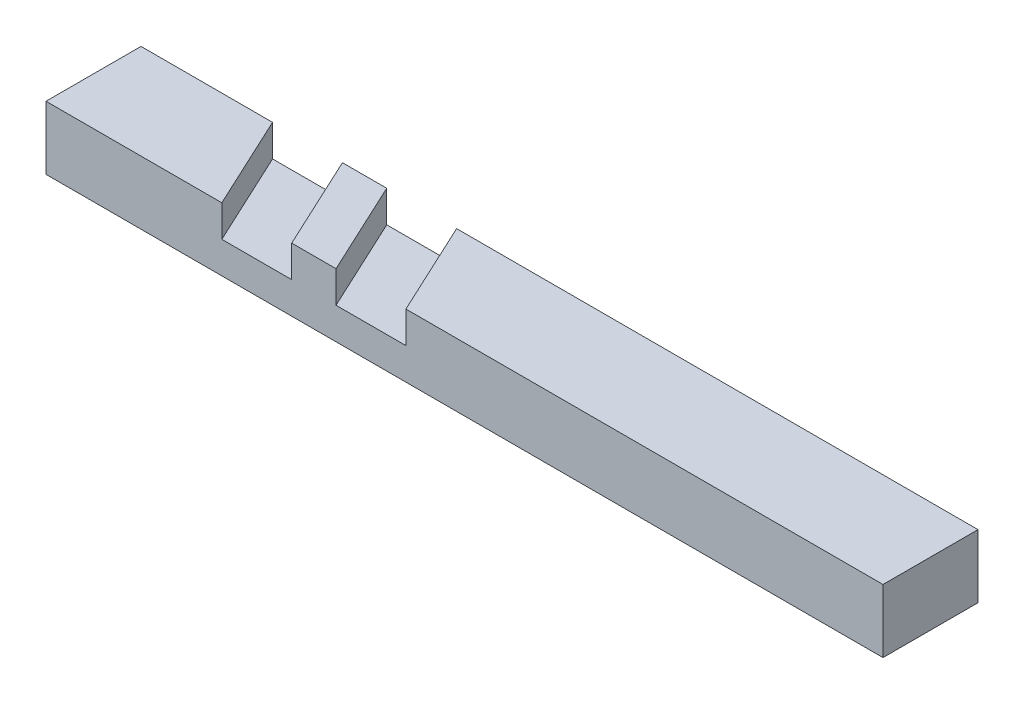
ISO-10303-21;
HEADER;
FILE_DESCRIPTION(('STEP AP214'),'2;1');
FILE_NAME('part.step','',(''),(''),'','','');
FILE_SCHEMA(('AUTOMOTIVE_DESIGN { 1 0 10303 214 1 1 1 1 }'));
ENDSEC;
DATA;
#1=APPLICATION_CONTEXT('core data for automotive mechanical design processes');
#2=APPLICATION_PROTOCOL_DEFINITION('international standard','automotive_design',2000,#1);
#3=PRODUCT_CONTEXT('',#1,'mechanical');
#4=PRODUCT('Part','Part','',(#3));
#5=PRODUCT_RELATED_PRODUCT_CATEGORY('part','',(#4));
#6=PRODUCT_DEFINITION_FORMATION('','',#4);
#7=PRODUCT_DEFINITION_CONTEXT('part definition',#1,'design');
#8=PRODUCT_DEFINITION('design','',#6,#7);
#9=PRODUCT_DEFINITION_SHAPE('','',#8);
#10=(LENGTH_UNIT() NAMED_UNIT(*) SI_UNIT(.MILLI.,.METRE.));
#11=(NAMED_UNIT(*) PLANE_ANGLE_UNIT() SI_UNIT($,.RADIAN.));
#12=(NAMED_UNIT(*) SI_UNIT($,.STERADIAN.) SOLID_ANGLE_UNIT());
#13=UNCERTAINTY_MEASURE_WITH_UNIT(LENGTH_MEASURE(1.E-05),#10,'distance_accuracy_value','');
#14=(GEOMETRIC_REPRESENTATION_CONTEXT(3) GLOBAL_UNCERTAINTY_ASSIGNED_CONTEXT((#13)) GLOBAL_UNIT_ASSIGNED_CONTEXT((#10,
#11,#12)) REPRESENTATION_CONTEXT('',''));
#15=CARTESIAN_POINT('',(0.,0.,0.));
#16=DIRECTION('',(0.,0.,1.));
#17=DIRECTION('',(1.,0.,0.));
#18=AXIS2_PLACEMENT_3D('',#15,#16,#17);
#19=CARTESIAN_POINT('',(0.,0.,0.));
#20=DIRECTION('',(0.,1.,0.));
#21=DIRECTION('',(0.,0.,1.));
#22=AXIS2_PLACEMENT_3D('',#19,#20,#21);
#23=PLANE('',#22);
#24=DIRECTION('',(1.,0.,0.));
#25=VECTOR('',#24,1.);
#26=CARTESIAN_POINT('',(0.,0.,0.));
#27=LINE('',#26,#25);
#28=CARTESIAN_POINT('',(-84.8651659804539,0.,0.));
#29=VERTEX_POINT('',#28);
#30=CARTESIAN_POINT('',(-73.831386790829,0.,0.));
#31=VERTEX_POINT('',#30);
#32=EDGE_CURVE('E62',#29,#31,#27,.T.);
#33=ORIENTED_EDGE('',*,*,#32,.T.);
#34=DIRECTION('',(0.422618261740697,0.,0.906307787036651));
#35=VECTOR('',#34,1.);
#36=CARTESIAN_POINT('',(-60.6446437129743,0.,28.2790617894411));
#37=LINE('',#36,#35);
#38=CARTESIAN_POINT('',(-80.826001663154,0.,-15.));
#39=VERTEX_POINT('',#38);
#40=EDGE_CURVE('E57',#39,#31,#37,.T.);
#41=ORIENTED_EDGE('',*,*,#40,.F.);
#42=DIRECTION('',(1.,0.,0.));
#43=VECTOR('',#42,1.);
#44=CARTESIAN_POINT('',(0.,0.,-15.));
#45=LINE('',#44,#43);
#46=CARTESIAN_POINT('',(-91.8597808527789,0.,-15.));
#47=VERTEX_POINT('',#46);
#48=EDGE_CURVE('E135',#47,#39,#45,.T.);
#49=ORIENTED_EDGE('',*,*,#48,.F.);
#50=DIRECTION('',(0.422618261740697,0.,0.906307787036651));
#51=VECTOR('',#50,1.);
#52=CARTESIAN_POINT('',(-69.7077215833408,0.,32.5052444068481));
#53=LINE('',#52,#51);
#54=EDGE_CURVE('E138',#47,#29,#53,.T.);
#55=ORIENTED_EDGE('',*,*,#54,.T.);
#56=EDGE_LOOP('',(#33,#41,#49,#55));
#57=FACE_BOUND('',#56,.T.);
#58=ADVANCED_FACE('F39',(#57),#23,.T.);
#59=CARTESIAN_POINT('',(-102.893560042404,0.,0.));
#60=VERTEX_POINT('',#59);
#61=CARTESIAN_POINT('',(-91.8597808527789,0.,0.));
#62=VERTEX_POINT('',#61);
#63=EDGE_CURVE('E230',#60,#62,#27,.T.);
#64=ORIENTED_EDGE('',*,*,#63,.T.);
#65=DIRECTION('',(0.422618261740697,0.,0.906307787036651));
#66=VECTOR('',#65,1.);
#67=CARTESIAN_POINT('',(-75.4530549067332,0.,35.184337334199));
#68=LINE('',#67,#66);
#69=CARTESIAN_POINT('',(-98.8543957251038,0.,-15.));
#70=VERTEX_POINT('',#69);
#71=EDGE_CURVE('E170',#70,#62,#68,.T.);
#72=ORIENTED_EDGE('',*,*,#71,.F.);
#73=CARTESIAN_POINT('',(-109.888174914729,0.,-15.));
#74=VERTEX_POINT('',#73);
#75=EDGE_CURVE('E241',#74,#70,#45,.T.);
#76=ORIENTED_EDGE('',*,*,#75,.F.);
#77=DIRECTION('',(0.422618261740697,0.,0.906307787036651));
#78=VECTOR('',#77,1.);
#79=CARTESIAN_POINT('',(-84.5161327770997,0.,39.410519951606));
#80=LINE('',#79,#78);
#81=EDGE_CURVE('E200',#74,#60,#80,.T.);
#82=ORIENTED_EDGE('',*,*,#81,.T.);
#83=EDGE_LOOP('',(#64,#72,#76,#82));
#84=FACE_BOUND('',#83,.T.);
#85=ADVANCED_FACE('F283',(#84),#23,.T.);
#86=CARTESIAN_POINT('',(0.,-5.,-15.));
#87=DIRECTION('',(0.,0.,1.));
#88=DIRECTION('',(1.,0.,0.));
#89=AXIS2_PLACEMENT_3D('',#86,#87,#88);
#90=PLANE('',#89);
#91=DIRECTION('',(0.,1.,0.));
#92=VECTOR('',#91,1.);
#93=CARTESIAN_POINT('',(-130.65513843956,-5.,-15.));
#94=LINE('',#93,#92);
#95=CARTESIAN_POINT('',(-130.65513843956,-5.,-15.));
#96=VERTEX_POINT('',#95);
#97=CARTESIAN_POINT('',(-130.65513843956,5.,-15.));
#98=VERTEX_POINT('',#97);
#99=EDGE_CURVE('E43',#96,#98,#94,.T.);
#100=ORIENTED_EDGE('',*,*,#99,.T.);
#101=DIRECTION('',(1.,0.,0.));
#102=VECTOR('',#101,1.);
#103=CARTESIAN_POINT('',(0.,5.,-15.));
#104=LINE('',#103,#102);
#105=CARTESIAN_POINT('',(-109.888174914729,5.,-15.));
#106=VERTEX_POINT('',#105);
#107=EDGE_CURVE('E201',#98,#106,#104,.T.);
#108=ORIENTED_EDGE('',*,*,#107,.T.);
#109=DIRECTION('',(0.,-1.,0.));
#110=VECTOR('',#109,1.);
#111=CARTESIAN_POINT('',(-109.888174914729,5.,-15.));
#112=LINE('',#111,#110);
#113=EDGE_CURVE('E216',#106,#74,#112,.T.);
#114=ORIENTED_EDGE('',*,*,#113,.T.);
#115=ORIENTED_EDGE('',*,*,#75,.T.);
#116=DIRECTION('',(0.,-1.,0.));
#117=VECTOR('',#116,1.);
#118=CARTESIAN_POINT('',(-98.8543957251038,5.,-15.));
#119=LINE('',#118,#117);
#120=CARTESIAN_POINT('',(-98.8543957251038,5.,-15.));
#121=VERTEX_POINT('',#120);
#122=EDGE_CURVE('E193',#121,#70,#119,.T.);
#123=ORIENTED_EDGE('',*,*,#122,.F.);
#124=DIRECTION('',(1.,0.,0.));
#125=VECTOR('',#124,1.);
#126=CARTESIAN_POINT('',(0.,5.,-15.));
#127=LINE('',#126,#125);
#128=CARTESIAN_POINT('',(-91.8597808527789,5.,-15.));
#129=VERTEX_POINT('',#128);
#130=EDGE_CURVE('E169',#121,#129,#127,.T.);
#131=ORIENTED_EDGE('',*,*,#130,.T.);
#132=DIRECTION('',(0.,-1.,0.));
#133=VECTOR('',#132,1.);
#134=CARTESIAN_POINT('',(-91.8597808527789,5.,-15.));
#135=LINE('',#134,#133);
#136=EDGE_CURVE('E197',#129,#47,#135,.T.);
#137=ORIENTED_EDGE('',*,*,#136,.T.);
#138=ORIENTED_EDGE('',*,*,#48,.T.);
#139=DIRECTION('',(0.,-1.,0.));
#140=VECTOR('',#139,1.);
#141=CARTESIAN_POINT('',(-80.826001663154,5.,-15.));
#142=LINE('',#141,#140);
#143=CARTESIAN_POINT('',(-80.826001663154,5.,-15.));
#144=VERTEX_POINT('',#143);
#145=EDGE_CURVE('E128',#144,#39,#142,.T.);
#146=ORIENTED_EDGE('',*,*,#145,.F.);
#147=DIRECTION('',(1.,0.,0.));
#148=VECTOR('',#147,1.);
#149=CARTESIAN_POINT('',(0.,5.,-15.));
#150=LINE('',#149,#148);
#151=CARTESIAN_POINT('',(1.48976704002033,5.,-15.));
#152=VERTEX_POINT('',#151);
#153=EDGE_CURVE('E132',#144,#152,#150,.T.);
#154=ORIENTED_EDGE('',*,*,#153,.T.);
#155=DIRECTION('',(0.,1.,0.));
#156=VECTOR('',#155,1.);
#157=CARTESIAN_POINT('',(1.48976704002033,-5.,-15.));
#158=LINE('',#157,#156);
#159=CARTESIAN_POINT('',(1.48976704002033,-5.,-15.));
#160=VERTEX_POINT('',#159);
#161=EDGE_CURVE('E11',#160,#152,#158,.T.);
#162=ORIENTED_EDGE('',*,*,#161,.F.);
#163=DIRECTION('',(1.,0.,0.));
#164=VECTOR('',#163,1.);
#165=CARTESIAN_POINT('',(0.,-5.,-15.));
#166=LINE('',#165,#164);
#167=EDGE_CURVE('E225',#96,#160,#166,.T.);
#168=ORIENTED_EDGE('',*,*,#167,.F.);
#169=EDGE_LOOP('',(#100,#108,#114,#115,#123,#131,#137,#138,#146,#154,#162,#168));
#170=FACE_BOUND('',#169,.T.);
#171=ADVANCED_FACE('F41',(#170),#90,.F.);
#172=CARTESIAN_POINT('',(1.48976704002033,-5.,0.));
#173=DIRECTION('',(-1.,0.,0.));
#174=DIRECTION('',(0.,0.,1.));
#175=AXIS2_PLACEMENT_3D('',#172,#173,#174);
#176=PLANE('',#175);
#177=ORIENTED_EDGE('',*,*,#161,.T.);
#178=DIRECTION('',(0.,0.,1.));
#179=VECTOR('',#178,1.);
#180=CARTESIAN_POINT('',(1.48976704002033,5.,0.));
#181=LINE('',#180,#179);
#182=CARTESIAN_POINT('',(1.48976704002033,5.,0.));
#183=VERTEX_POINT('',#182);
#184=EDGE_CURVE('E153',#152,#183,#181,.T.);
#185=ORIENTED_EDGE('',*,*,#184,.T.);
#186=DIRECTION('',(0.,1.,0.));
#187=VECTOR('',#186,1.);
#188=CARTESIAN_POINT('',(1.48976704002033,-5.,0.));
#189=LINE('',#188,#187);
#190=CARTESIAN_POINT('',(1.48976704002033,-5.,0.));
#191=VERTEX_POINT('',#190);
#192=EDGE_CURVE('E49',#191,#183,#189,.T.);
#193=ORIENTED_EDGE('',*,*,#192,.F.);
#194=DIRECTION('',(0.,0.,1.));
#195=VECTOR('',#194,1.);
#196=CARTESIAN_POINT('',(1.48976704002033,-5.,0.));
#197=LINE('',#196,#195);
#198=EDGE_CURVE('E238',#160,#191,#197,.T.);
#199=ORIENTED_EDGE('',*,*,#198,.F.);
#200=EDGE_LOOP('',(#177,#185,#193,#199));
#201=FACE_BOUND('',#200,.T.);
#202=ADVANCED_FACE('F292',(#201),#176,.F.);
#203=CARTESIAN_POINT('',(0.,-5.,0.));
#204=DIRECTION('',(0.,0.,1.));
#205=DIRECTION('',(1.,0.,0.));
#206=AXIS2_PLACEMENT_3D('',#203,#204,#205);
#207=PLANE('',#206);
#208=ORIENTED_EDGE('',*,*,#63,.F.);
#209=DIRECTION('',(0.,-1.,0.));
#210=VECTOR('',#209,1.);
#211=CARTESIAN_POINT('',(-102.893560042404,5.,0.));
#212=LINE('',#211,#210);
#213=CARTESIAN_POINT('',(-102.893560042404,5.,0.));
#214=VERTEX_POINT('',#213);
#215=EDGE_CURVE('E222',#214,#60,#212,.T.);
#216=ORIENTED_EDGE('',*,*,#215,.F.);
#217=DIRECTION('',(1.,0.,0.));
#218=VECTOR('',#217,1.);
#219=CARTESIAN_POINT('',(0.,5.,0.));
#220=LINE('',#219,#218);
#221=CARTESIAN_POINT('',(-130.65513843956,5.,0.));
#222=VERTEX_POINT('',#221);
#223=EDGE_CURVE('E209',#222,#214,#220,.T.);
#224=ORIENTED_EDGE('',*,*,#223,.F.);
#225=DIRECTION('',(0.,1.,0.));
#226=VECTOR('',#225,1.);
#227=CARTESIAN_POINT('',(-130.65513843956,-5.,0.));
#228=LINE('',#227,#226);
#229=CARTESIAN_POINT('',(-130.65513843956,-5.,0.));
#230=VERTEX_POINT('',#229);
#231=EDGE_CURVE('E248',#230,#222,#228,.T.);
#232=ORIENTED_EDGE('',*,*,#231,.F.);
#233=DIRECTION('',(1.,0.,0.));
#234=VECTOR('',#233,1.);
#235=CARTESIAN_POINT('',(0.,-5.,0.));
#236=LINE('',#235,#234);
#237=EDGE_CURVE('E234',#230,#191,#236,.T.);
#238=ORIENTED_EDGE('',*,*,#237,.T.);
#239=ORIENTED_EDGE('',*,*,#192,.T.);
#240=DIRECTION('',(1.,0.,0.));
#241=VECTOR('',#240,1.);
#242=CARTESIAN_POINT('',(0.,5.,0.));
#243=LINE('',#242,#241);
#244=CARTESIAN_POINT('',(-73.831386790829,5.,0.));
#245=VERTEX_POINT('',#244);
#246=EDGE_CURVE('E149',#245,#183,#243,.T.);
#247=ORIENTED_EDGE('',*,*,#246,.F.);
#248=DIRECTION('',(0.,-1.,0.));
#249=VECTOR('',#248,1.);
#250=CARTESIAN_POINT('',(-73.831386790829,5.,0.));
#251=LINE('',#250,#249);
#252=EDGE_CURVE('E139',#245,#31,#251,.T.);
#253=ORIENTED_EDGE('',*,*,#252,.T.);
#254=ORIENTED_EDGE('',*,*,#32,.F.);
#255=DIRECTION('',(0.,-1.,0.));
#256=VECTOR('',#255,1.);
#257=CARTESIAN_POINT('',(-84.8651659804539,5.,0.));
#258=LINE('',#257,#256);
#259=CARTESIAN_POINT('',(-84.8651659804539,5.,0.));
#260=VERTEX_POINT('',#259);
#261=EDGE_CURVE('E180',#260,#29,#258,.T.);
#262=ORIENTED_EDGE('',*,*,#261,.F.);
#263=DIRECTION('',(1.,0.,0.));
#264=VECTOR('',#263,1.);
#265=CARTESIAN_POINT('',(0.,5.,0.));
#266=LINE('',#265,#264);
#267=CARTESIAN_POINT('',(-91.8597808527789,5.,0.));
#268=VERTEX_POINT('',#267);
#269=EDGE_CURVE('E177',#268,#260,#266,.T.);
#270=ORIENTED_EDGE('',*,*,#269,.F.);
#271=DIRECTION('',(0.,-1.,0.));
#272=VECTOR('',#271,1.);
#273=CARTESIAN_POINT('',(-91.8597808527789,5.,0.));
#274=LINE('',#273,#272);
#275=EDGE_CURVE('E189',#268,#62,#274,.T.);
#276=ORIENTED_EDGE('',*,*,#275,.T.);
#277=EDGE_LOOP('',(#208,#216,#224,#232,#238,#239,#247,#253,#254,#262,#270,#276));
#278=FACE_BOUND('',#277,.T.);
#279=ADVANCED_FACE('F295',(#278),#207,.T.);
#280=CARTESIAN_POINT('',(-130.65513843956,-5.,0.));
#281=DIRECTION('',(-1.,0.,0.));
#282=DIRECTION('',(0.,0.,1.));
#283=AXIS2_PLACEMENT_3D('',#280,#281,#282);
#284=PLANE('',#283);
#285=ORIENTED_EDGE('',*,*,#231,.T.);
#286=DIRECTION('',(0.,0.,1.));
#287=VECTOR('',#286,1.);
#288=CARTESIAN_POINT('',(-130.65513843956,5.,0.));
#289=LINE('',#288,#287);
#290=EDGE_CURVE('E205',#98,#222,#289,.T.);
#291=ORIENTED_EDGE('',*,*,#290,.F.);
#292=ORIENTED_EDGE('',*,*,#99,.F.);
#293=DIRECTION('',(0.,0.,1.));
#294=VECTOR('',#293,1.);
#295=CARTESIAN_POINT('',(-130.65513843956,-5.,0.));
#296=LINE('',#295,#294);
#297=EDGE_CURVE('E229',#96,#230,#296,.T.);
#298=ORIENTED_EDGE('',*,*,#297,.T.);
#299=EDGE_LOOP('',(#285,#291,#292,#298));
#300=FACE_BOUND('',#299,.T.);
#301=ADVANCED_FACE('F257',(#300),#284,.T.);
#302=CARTESIAN_POINT('',(0.,-5.,0.));
#303=DIRECTION('',(0.,1.,0.));
#304=DIRECTION('',(0.,0.,1.));
#305=AXIS2_PLACEMENT_3D('',#302,#303,#304);
#306=PLANE('',#305);
#307=ORIENTED_EDGE('',*,*,#167,.T.);
#308=ORIENTED_EDGE('',*,*,#198,.T.);
#309=ORIENTED_EDGE('',*,*,#237,.F.);
#310=ORIENTED_EDGE('',*,*,#297,.F.);
#311=EDGE_LOOP('',(#307,#308,#309,#310));
#312=FACE_BOUND('',#311,.T.);
#313=ADVANCED_FACE('F290',(#312),#306,.F.);
#314=CARTESIAN_POINT('',(-84.5161327770997,5.,39.410519951606));
#315=DIRECTION('',(0.906307787036651,0.,-0.422618261740697));
#316=DIRECTION('',(-0.422618261740697,0.,-0.906307787036651));
#317=AXIS2_PLACEMENT_3D('',#314,#315,#316);
#318=PLANE('',#317);
#319=ORIENTED_EDGE('',*,*,#81,.F.);
#320=ORIENTED_EDGE('',*,*,#113,.F.);
#321=DIRECTION('',(0.422618261740697,0.,0.906307787036651));
#322=VECTOR('',#321,1.);
#323=CARTESIAN_POINT('',(-84.5161327770997,5.,39.410519951606));
#324=LINE('',#323,#322);
#325=EDGE_CURVE('E212',#106,#214,#324,.T.);
#326=ORIENTED_EDGE('',*,*,#325,.T.);
#327=ORIENTED_EDGE('',*,*,#215,.T.);
#328=EDGE_LOOP('',(#319,#320,#326,#327));
#329=FACE_BOUND('',#328,.T.);
#330=ADVANCED_FACE('F264',(#329),#318,.T.);
#331=CARTESIAN_POINT('',(0.,5.,0.));
#332=DIRECTION('',(0.,1.,0.));
#333=DIRECTION('',(0.,0.,1.));
#334=AXIS2_PLACEMENT_3D('',#331,#332,#333);
#335=PLANE('',#334);
#336=ORIENTED_EDGE('',*,*,#107,.F.);
#337=ORIENTED_EDGE('',*,*,#290,.T.);
#338=ORIENTED_EDGE('',*,*,#223,.T.);
#339=ORIENTED_EDGE('',*,*,#325,.F.);
#340=EDGE_LOOP('',(#336,#337,#338,#339));
#341=FACE_BOUND('',#340,.T.);
#342=ADVANCED_FACE('F260',(#341),#335,.T.);
#343=CARTESIAN_POINT('',(-69.7077215833408,5.,32.5052444068481));
#344=DIRECTION('',(0.906307787036651,0.,-0.422618261740697));
#345=DIRECTION('',(-0.422618261740697,0.,-0.906307787036651));
#346=AXIS2_PLACEMENT_3D('',#343,#344,#345);
#347=PLANE('',#346);
#348=ORIENTED_EDGE('',*,*,#54,.F.);
#349=ORIENTED_EDGE('',*,*,#136,.F.);
#350=DIRECTION('',(0.422618261740697,0.,0.906307787036651));
#351=VECTOR('',#350,1.);
#352=CARTESIAN_POINT('',(-69.7077215833408,5.,32.5052444068481));
#353=LINE('',#352,#351);
#354=EDGE_CURVE('E165',#129,#260,#353,.T.);
#355=ORIENTED_EDGE('',*,*,#354,.T.);
#356=ORIENTED_EDGE('',*,*,#261,.T.);
#357=EDGE_LOOP('',(#348,#349,#355,#356));
#358=FACE_BOUND('',#357,.T.);
#359=ADVANCED_FACE('F278',(#358),#347,.T.);
#360=CARTESIAN_POINT('',(-75.4530549067332,5.,35.184337334199));
#361=DIRECTION('',(0.906307787036651,0.,-0.422618261740697));
#362=DIRECTION('',(-0.422618261740697,0.,-0.906307787036651));
#363=AXIS2_PLACEMENT_3D('',#360,#361,#362);
#364=PLANE('',#363);
#365=ORIENTED_EDGE('',*,*,#71,.T.);
#366=ORIENTED_EDGE('',*,*,#275,.F.);
#367=DIRECTION('',(0.422618261740697,0.,0.906307787036651));
#368=VECTOR('',#367,1.);
#369=CARTESIAN_POINT('',(-75.4530549067332,5.,35.184337334199));
#370=LINE('',#369,#368);
#371=EDGE_CURVE('E174',#121,#268,#370,.T.);
#372=ORIENTED_EDGE('',*,*,#371,.F.);
#373=ORIENTED_EDGE('',*,*,#122,.T.);
#374=EDGE_LOOP('',(#365,#366,#372,#373));
#375=FACE_BOUND('',#374,.T.);
#376=ADVANCED_FACE('F269',(#375),#364,.F.);
#377=CARTESIAN_POINT('',(0.,5.,0.));
#378=DIRECTION('',(0.,1.,0.));
#379=DIRECTION('',(0.,0.,1.));
#380=AXIS2_PLACEMENT_3D('',#377,#378,#379);
#381=PLANE('',#380);
#382=ORIENTED_EDGE('',*,*,#354,.F.);
#383=ORIENTED_EDGE('',*,*,#130,.F.);
#384=ORIENTED_EDGE('',*,*,#371,.T.);
#385=ORIENTED_EDGE('',*,*,#269,.T.);
#386=EDGE_LOOP('',(#382,#383,#384,#385));
#387=FACE_BOUND('',#386,.T.);
#388=ADVANCED_FACE('F275',(#387),#381,.T.);
#389=CARTESIAN_POINT('',(-60.6446437129743,5.,28.2790617894411));
#390=DIRECTION('',(0.906307787036651,0.,-0.422618261740697));
#391=DIRECTION('',(-0.422618261740697,0.,-0.906307787036651));
#392=AXIS2_PLACEMENT_3D('',#389,#390,#391);
#393=PLANE('',#392);
#394=ORIENTED_EDGE('',*,*,#40,.T.);
#395=ORIENTED_EDGE('',*,*,#252,.F.);
#396=DIRECTION('',(0.422618261740697,0.,0.906307787036651));
#397=VECTOR('',#396,1.);
#398=CARTESIAN_POINT('',(-60.6446437129743,5.,28.2790617894411));
#399=LINE('',#398,#397);
#400=EDGE_CURVE('E142',#144,#245,#399,.T.);
#401=ORIENTED_EDGE('',*,*,#400,.F.);
#402=ORIENTED_EDGE('',*,*,#145,.T.);
#403=EDGE_LOOP('',(#394,#395,#401,#402));
#404=FACE_BOUND('',#403,.T.);
#405=ADVANCED_FACE('F143',(#404),#393,.F.);
#406=CARTESIAN_POINT('',(0.,5.,0.));
#407=DIRECTION('',(0.,1.,0.));
#408=DIRECTION('',(0.,0.,1.));
#409=AXIS2_PLACEMENT_3D('',#406,#407,#408);
#410=PLANE('',#409);
#411=ORIENTED_EDGE('',*,*,#153,.F.);
#412=ORIENTED_EDGE('',*,*,#400,.T.);
#413=ORIENTED_EDGE('',*,*,#246,.T.);
#414=ORIENTED_EDGE('',*,*,#184,.F.);
#415=EDGE_LOOP('',(#411,#412,#413,#414));
#416=FACE_BOUND('',#415,.T.);
#417=ADVANCED_FACE('F151',(#416),#410,.T.);
#418=CLOSED_SHELL('',(#58,#85,#171,#202,#279,#301,#313,#330,#342,#359,#376,#388,#405,#417));
#419=MANIFOLD_SOLID_BREP('B2',#418);
#420=ADVANCED_BREP_SHAPE_REPRESENTATION('',(#18,#419),#14);
#421=SHAPE_DEFINITION_REPRESENTATION(#9,#420);
ENDSEC;
END-ISO-10303-21;
